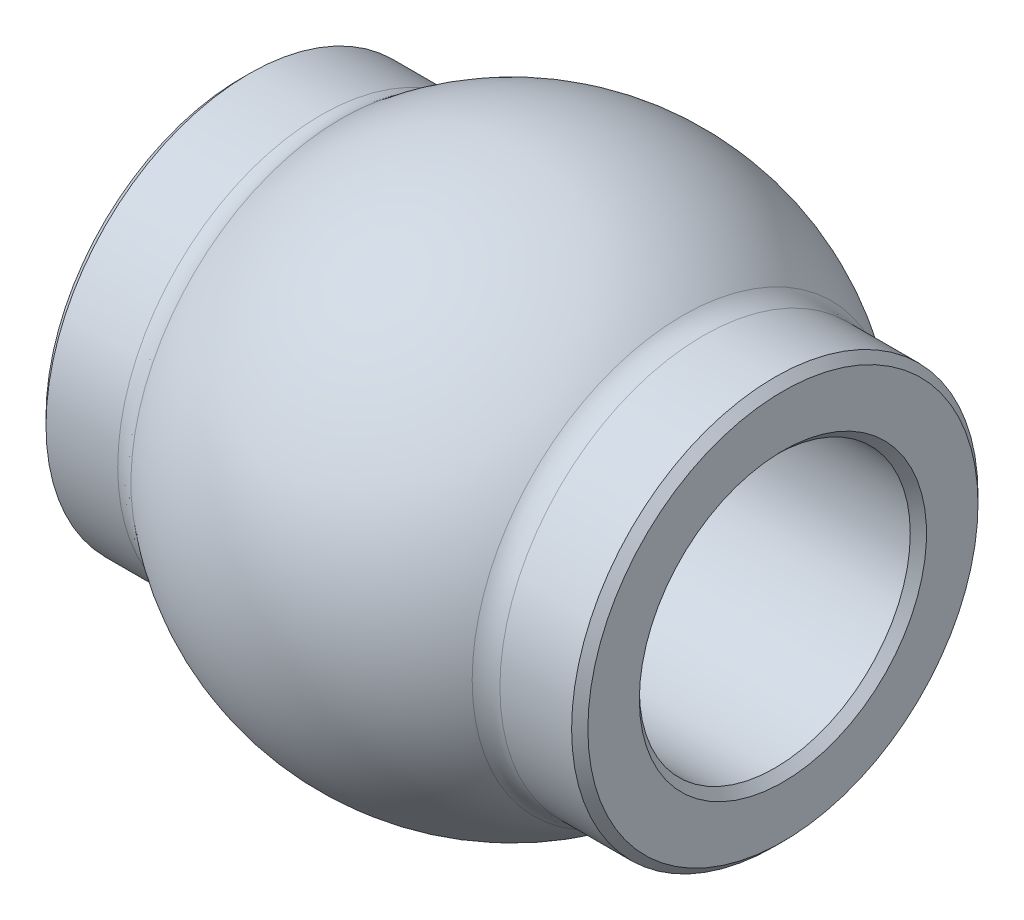
ISO-10303-21;
HEADER;
FILE_DESCRIPTION(('STEP AP214'),'2;1');
FILE_NAME('part.step','',(''),(''),'','','');
FILE_SCHEMA(('AUTOMOTIVE_DESIGN { 1 0 10303 214 1 1 1 1 }'));
ENDSEC;
DATA;
#1=APPLICATION_CONTEXT('core data for automotive mechanical design processes');
#2=APPLICATION_PROTOCOL_DEFINITION('international standard','automotive_design',2000,#1);
#3=PRODUCT_CONTEXT('',#1,'mechanical');
#4=PRODUCT('Part','Part','',(#3));
#5=PRODUCT_RELATED_PRODUCT_CATEGORY('part','',(#4));
#6=PRODUCT_DEFINITION_FORMATION('','',#4);
#7=PRODUCT_DEFINITION_CONTEXT('part definition',#1,'design');
#8=PRODUCT_DEFINITION('design','',#6,#7);
#9=PRODUCT_DEFINITION_SHAPE('','',#8);
#10=(LENGTH_UNIT() NAMED_UNIT(*) SI_UNIT(.MILLI.,.METRE.));
#11=(NAMED_UNIT(*) PLANE_ANGLE_UNIT() SI_UNIT($,.RADIAN.));
#12=(NAMED_UNIT(*) SI_UNIT($,.STERADIAN.) SOLID_ANGLE_UNIT());
#13=UNCERTAINTY_MEASURE_WITH_UNIT(LENGTH_MEASURE(1.E-05),#10,'distance_accuracy_value','');
#14=(GEOMETRIC_REPRESENTATION_CONTEXT(3) GLOBAL_UNCERTAINTY_ASSIGNED_CONTEXT((#13)) GLOBAL_UNIT_ASSIGNED_CONTEXT((#10,
#11,#12)) REPRESENTATION_CONTEXT('',''));
#15=CARTESIAN_POINT('',(0.,0.,0.));
#16=DIRECTION('',(0.,0.,1.));
#17=DIRECTION('',(1.,0.,0.));
#18=AXIS2_PLACEMENT_3D('',#15,#16,#17);
#19=CARTESIAN_POINT('',(-19.7341731109294,0.,0.));
#20=DIRECTION('',(-1.,0.,0.));
#21=DIRECTION('',(0.,0.,1.));
#22=AXIS2_PLACEMENT_3D('',#19,#20,#21);
#23=CYLINDRICAL_SURFACE('',#22,9.525);
#24=CARTESIAN_POINT('',(12.319,0.,0.));
#25=DIRECTION('',(-1.,0.,0.));
#26=DIRECTION('',(0.,0.,1.));
#27=AXIS2_PLACEMENT_3D('',#24,#25,#26);
#28=CIRCLE('',#27,9.525);
#29=CARTESIAN_POINT('',(12.319,0.,9.525));
#30=VERTEX_POINT('',#29);
#31=EDGE_CURVE('E40',#30,#30,#28,.T.);
#32=ORIENTED_EDGE('',*,*,#31,.T.);
#33=EDGE_LOOP('',(#32));
#34=FACE_BOUND('',#33,.T.);
#35=CARTESIAN_POINT('',(8.95777734708785,0.,0.));
#36=DIRECTION('',(-1.,0.,0.));
#37=DIRECTION('',(0.,0.,1.));
#38=AXIS2_PLACEMENT_3D('',#35,#36,#37);
#39=CIRCLE('',#38,9.525);
#40=CARTESIAN_POINT('',(8.95777734708785,0.,9.525));
#41=VERTEX_POINT('',#40);
#42=EDGE_CURVE('E68',#41,#41,#39,.F.);
#43=ORIENTED_EDGE('',*,*,#42,.T.);
#44=EDGE_LOOP('',(#43));
#45=FACE_BOUND('',#44,.T.);
#46=ADVANCED_FACE('F33',(#34,#45),#23,.T.);
#47=CARTESIAN_POINT('',(12.7,0.,0.));
#48=DIRECTION('',(-1.,0.,0.));
#49=DIRECTION('',(0.,0.,1.));
#50=AXIS2_PLACEMENT_3D('',#47,#48,#49);
#51=PLANE('',#50);
#52=CARTESIAN_POINT('',(12.7,0.,0.));
#53=DIRECTION('',(-1.,0.,0.));
#54=DIRECTION('',(0.,0.,1.));
#55=AXIS2_PLACEMENT_3D('',#52,#53,#54);
#56=CIRCLE('',#55,6.73099999999999);
#57=CARTESIAN_POINT('',(12.7,0.,6.73099999999999));
#58=VERTEX_POINT('',#57);
#59=EDGE_CURVE('E53',#58,#58,#56,.T.);
#60=ORIENTED_EDGE('',*,*,#59,.T.);
#61=EDGE_LOOP('',(#60));
#62=FACE_BOUND('',#61,.T.);
#63=CARTESIAN_POINT('',(12.7,0.,0.));
#64=DIRECTION('',(-1.,0.,0.));
#65=DIRECTION('',(0.,0.,1.));
#66=AXIS2_PLACEMENT_3D('',#63,#64,#65);
#67=CIRCLE('',#66,9.14400000000001);
#68=CARTESIAN_POINT('',(12.7,0.,9.14400000000001));
#69=VERTEX_POINT('',#68);
#70=EDGE_CURVE('E56',#69,#69,#67,.F.);
#71=ORIENTED_EDGE('',*,*,#70,.T.);
#72=EDGE_LOOP('',(#71));
#73=FACE_BOUND('',#72,.T.);
#74=ADVANCED_FACE('F99',(#62,#73),#51,.F.);
#75=CARTESIAN_POINT('',(-12.7,0.,0.));
#76=DIRECTION('',(1.,0.,0.));
#77=DIRECTION('',(0.,0.,-1.));
#78=AXIS2_PLACEMENT_3D('',#75,#76,#77);
#79=PLANE('',#78);
#80=CARTESIAN_POINT('',(-12.7,0.,0.));
#81=DIRECTION('',(1.,0.,0.));
#82=DIRECTION('',(0.,0.,-1.));
#83=AXIS2_PLACEMENT_3D('',#80,#81,#82);
#84=CIRCLE('',#83,6.731);
#85=CARTESIAN_POINT('',(-12.7,0.,-6.731));
#86=VERTEX_POINT('',#85);
#87=EDGE_CURVE('E44',#86,#86,#84,.T.);
#88=ORIENTED_EDGE('',*,*,#87,.T.);
#89=EDGE_LOOP('',(#88));
#90=FACE_BOUND('',#89,.T.);
#91=CARTESIAN_POINT('',(-12.7,0.,0.));
#92=DIRECTION('',(1.,0.,0.));
#93=DIRECTION('',(0.,0.,-1.));
#94=AXIS2_PLACEMENT_3D('',#91,#92,#93);
#95=CIRCLE('',#94,9.144);
#96=CARTESIAN_POINT('',(-12.7,0.,-9.144));
#97=VERTEX_POINT('',#96);
#98=EDGE_CURVE('E48',#97,#97,#95,.F.);
#99=ORIENTED_EDGE('',*,*,#98,.T.);
#100=EDGE_LOOP('',(#99));
#101=FACE_BOUND('',#100,.T.);
#102=ADVANCED_FACE('F90',(#90,#101),#79,.F.);
#103=CARTESIAN_POINT('',(-19.7341731109294,0.,0.));
#104=DIRECTION('',(-1.,0.,0.));
#105=DIRECTION('',(0.,0.,1.));
#106=AXIS2_PLACEMENT_3D('',#103,#104,#105);
#107=CYLINDRICAL_SURFACE('',#106,9.525);
#108=CARTESIAN_POINT('',(-12.319,0.,0.));
#109=DIRECTION('',(1.,0.,0.));
#110=DIRECTION('',(0.,0.,-1.));
#111=AXIS2_PLACEMENT_3D('',#108,#109,#110);
#112=CIRCLE('',#111,9.525);
#113=CARTESIAN_POINT('',(-12.319,0.,-9.525));
#114=VERTEX_POINT('',#113);
#115=EDGE_CURVE('E10',#114,#114,#112,.T.);
#116=ORIENTED_EDGE('',*,*,#115,.T.);
#117=EDGE_LOOP('',(#116));
#118=FACE_BOUND('',#117,.T.);
#119=CARTESIAN_POINT('',(-8.95777734708785,0.,0.));
#120=DIRECTION('',(1.,0.,0.));
#121=DIRECTION('',(0.,0.,-1.));
#122=AXIS2_PLACEMENT_3D('',#119,#120,#121);
#123=CIRCLE('',#122,9.525);
#124=CARTESIAN_POINT('',(-8.95777734708785,0.,-9.525));
#125=VERTEX_POINT('',#124);
#126=EDGE_CURVE('E65',#125,#125,#123,.F.);
#127=ORIENTED_EDGE('',*,*,#126,.T.);
#128=EDGE_LOOP('',(#127));
#129=FACE_BOUND('',#128,.T.);
#130=ADVANCED_FACE('F88',(#118,#129),#107,.T.);
#131=CARTESIAN_POINT('',(0.,0.,0.));
#132=DIRECTION('',(-1.,0.,0.));
#133=DIRECTION('',(0.,1.,0.));
#134=AXIS2_PLACEMENT_3D('',#131,#132,#133);
#135=SPHERICAL_SURFACE('',#134,12.7);
#136=CARTESIAN_POINT('',(7.9980154884713,0.,0.));
#137=DIRECTION('',(-1.,0.,0.));
#138=DIRECTION('',(0.,0.,1.));
#139=AXIS2_PLACEMENT_3D('',#136,#137,#138);
#140=CIRCLE('',#139,9.86517857142857);
#141=CARTESIAN_POINT('',(7.9980154884713,9.86517857142856,0.));
#142=VERTEX_POINT('',#141);
#143=EDGE_CURVE('E71',#142,#142,#140,.T.);
#144=CARTESIAN_POINT('',(-7.9980154884713,0.,0.));
#145=DIRECTION('',(1.,0.,0.));
#146=DIRECTION('',(0.,0.,-1.));
#147=AXIS2_PLACEMENT_3D('',#144,#145,#146);
#148=CIRCLE('',#147,9.86517857142857);
#149=CARTESIAN_POINT('',(-7.9980154884713,9.86517857142856,0.));
#150=VERTEX_POINT('',#149);
#151=EDGE_CURVE('E74',#150,#150,#148,.T.);
#152=CARTESIAN_POINT('',(7.9980154884713,9.86517857142856,0.));
#153=CARTESIAN_POINT('',(7.85800324572026,9.97869418364085,0.));
#154=CARTESIAN_POINT('',(7.71557145775517,10.0892251073674,0.));
#155=CARTESIAN_POINT('',(7.42613350640541,10.3041260340785,0.));
#156=CARTESIAN_POINT('',(7.27912734302074,10.408496037063,0.));
#157=CARTESIAN_POINT('',(6.98080535584032,10.6108835785192,0.));
#158=CARTESIAN_POINT('',(6.82948953204458,10.7089011169909,0.));
#159=CARTESIAN_POINT('',(6.52282297259072,10.8984066926035,0.));
#160=CARTESIAN_POINT('',(6.36747223693261,10.9898947297443,0.));
#161=CARTESIAN_POINT('',(6.05301732077754,11.1661752996362,0.));
#162=CARTESIAN_POINT('',(5.89391314028059,11.2509678323872,0.));
#163=CARTESIAN_POINT('',(5.5722397645777,11.4137037417259,0.));
#164=CARTESIAN_POINT('',(5.40967056937176,11.4916471183135,0.));
#165=CARTESIAN_POINT('',(5.08136183241597,11.6405434209467,0.));
#166=CARTESIAN_POINT('',(4.91562229066613,11.7114963469922,0.));
#167=CARTESIAN_POINT('',(4.58127328689367,11.8462831406616,0.));
#168=CARTESIAN_POINT('',(4.41266382487105,11.9101170082855,0.));
#169=CARTESIAN_POINT('',(4.07288060584844,12.0305499772913,0.));
#170=CARTESIAN_POINT('',(3.90170684884845,12.0871490786733,0.));
#171=CARTESIAN_POINT('',(3.5571053140972,12.1930099224102,0.));
#172=CARTESIAN_POINT('',(3.38367753634595,12.2422716647651,0.));
#173=CARTESIAN_POINT('',(3.03488231979527,12.3333684972558,0.));
#174=CARTESIAN_POINT('',(2.85951488099585,12.3752035873915,0.));
#175=CARTESIAN_POINT('',(2.50715821799157,12.4513712840764,0.));
#176=CARTESIAN_POINT('',(2.33016899378671,12.4857038906256,0.));
#177=CARTESIAN_POINT('',(1.97488957528933,12.5468043879474,0.));
#178=CARTESIAN_POINT('',(1.79659938099682,12.5735722787201,0.));
#179=CARTESIAN_POINT('',(1.43904119581872,12.6194948243077,0.));
#180=CARTESIAN_POINT('',(1.25977320493314,12.6386494791226,0.));
#181=CARTESIAN_POINT('',(0.900584372442216,12.6693108325634,0.));
#182=CARTESIAN_POINT('',(0.720663530836862,12.6808175311893,0.));
#183=CARTESIAN_POINT('',(0.36049512615434,12.6961621149076,0.));
#184=CARTESIAN_POINT('',(0.180247563077172,12.7,0.));
#185=CARTESIAN_POINT('',(-0.180247563077166,12.7,0.));
#186=CARTESIAN_POINT('',(-0.360495126154335,12.6961621149076,0.));
#187=CARTESIAN_POINT('',(-0.720663530836856,12.6808175311893,0.));
#188=CARTESIAN_POINT('',(-0.90058437244221,12.6693108325634,0.));
#189=CARTESIAN_POINT('',(-1.25977320493314,12.6386494791226,0.));
#190=CARTESIAN_POINT('',(-1.43904119581871,12.6194948243077,0.));
#191=CARTESIAN_POINT('',(-1.79659938099681,12.5735722787201,0.));
#192=CARTESIAN_POINT('',(-1.97488957528933,12.5468043879474,0.));
#193=CARTESIAN_POINT('',(-2.33016899378671,12.4857038906256,0.));
#194=CARTESIAN_POINT('',(-2.50715821799157,12.4513712840764,0.));
#195=CARTESIAN_POINT('',(-2.85951488099585,12.3752035873915,0.));
#196=CARTESIAN_POINT('',(-3.03488231979527,12.3333684972558,0.));
#197=CARTESIAN_POINT('',(-3.38367753634594,12.2422716647651,0.));
#198=CARTESIAN_POINT('',(-3.55710531409719,12.1930099224102,0.));
#199=CARTESIAN_POINT('',(-3.90170684884844,12.0871490786733,0.));
#200=CARTESIAN_POINT('',(-4.07288060584844,12.0305499772913,0.));
#201=CARTESIAN_POINT('',(-4.41266382487105,11.9101170082855,0.));
#202=CARTESIAN_POINT('',(-4.58127328689366,11.8462831406616,0.));
#203=CARTESIAN_POINT('',(-4.91562229066612,11.7114963469922,0.));
#204=CARTESIAN_POINT('',(-5.08136183241597,11.6405434209467,0.));
#205=CARTESIAN_POINT('',(-5.40967056937176,11.4916471183135,0.));
#206=CARTESIAN_POINT('',(-5.5722397645777,11.4137037417259,0.));
#207=CARTESIAN_POINT('',(-5.89391314028059,11.2509678323872,0.));
#208=CARTESIAN_POINT('',(-6.05301732077754,11.1661752996362,0.));
#209=CARTESIAN_POINT('',(-6.3674722369326,10.9898947297443,0.));
#210=CARTESIAN_POINT('',(-6.52282297259072,10.8984066926035,0.));
#211=CARTESIAN_POINT('',(-6.82948953204458,10.7089011169909,0.));
#212=CARTESIAN_POINT('',(-6.98080535584032,10.6108835785192,0.));
#213=CARTESIAN_POINT('',(-7.27912734302073,10.408496037063,0.));
#214=CARTESIAN_POINT('',(-7.4261335064054,10.3041260340785,0.));
#215=CARTESIAN_POINT('',(-7.71557145775517,10.0892251073674,0.));
#216=CARTESIAN_POINT('',(-7.85800324572026,9.97869418364085,0.));
#217=CARTESIAN_POINT('',(-7.9980154884713,9.86517857142856,0.));
#218=B_SPLINE_CURVE_WITH_KNOTS('',3,(#152,#153,#154,#155,#156,#157,#158,#159,#160,#161,#162,
#163,#164,#165,#166,#167,#168,#169,#170,#171,#172,#173,#174,#175,#176,#177,#178,#179,#180,#181,
#182,#183,#184,#185,#186,#187,#188,#189,#190,#191,#192,#193,#194,#195,#196,#197,#198,#199,#200,
#201,#202,#203,#204,#205,#206,#207,#208,#209,#210,#211,#212,#213,#214,#215,#216,#217),
.UNSPECIFIED.,.F.,.F.,(4,2,2,2,2,2,2,2,2,2,2,2,2,2,2,2,2,2,2,2,2,2,2,2,2,2,2,2,2,2,2,2,4),(0.,
0.540701853677429,1.08140370735486,1.62210556103229,2.16280741470972,2.70350926838715,
3.24421112206458,3.78491297574201,4.32561482941944,4.86631668309687,5.4070185367743,
5.94772039045173,6.48842224412916,7.02912409780659,7.56982595148402,8.11052780516145,
8.65122965883888,9.19193151251631,9.73263336619375,10.2733352198712,10.8140370735486,
11.354738927226,11.8954407809035,12.4361426345809,12.9768444882583,13.5175463419358,
14.0582481956132,14.5989500492906,15.139651902968,15.6803537566455,16.2210556103229,
16.7617574640003,17.3024593176778),.UNSPECIFIED.);
#219=EDGE_CURVE('BSEAM78',#142,#150,#218,.T.);
#220=ORIENTED_EDGE('',*,*,#143,.T.);
#221=ORIENTED_EDGE('',*,*,#151,.T.);
#222=ORIENTED_EDGE('',*,*,#219,.T.);
#223=ORIENTED_EDGE('',*,*,#219,.F.);
#224=EDGE_LOOP('',(#220,#222,#221,#223));
#225=FACE_BOUND('',#224,.T.);
#226=ADVANCED_FACE('F78',(#225),#135,.T.);
#227=CARTESIAN_POINT('',(-12.7,0.,0.));
#228=DIRECTION('',(1.,0.,0.));
#229=DIRECTION('',(0.,0.,-1.));
#230=AXIS2_PLACEMENT_3D('',#227,#228,#229);
#231=CYLINDRICAL_SURFACE('',#230,6.35);
#232=CARTESIAN_POINT('',(12.319,0.,0.));
#233=DIRECTION('',(-1.,0.,0.));
#234=DIRECTION('',(0.,0.,1.));
#235=AXIS2_PLACEMENT_3D('',#232,#233,#234);
#236=CIRCLE('',#235,6.35);
#237=CARTESIAN_POINT('',(12.319,0.,6.35));
#238=VERTEX_POINT('',#237);
#239=EDGE_CURVE('E59',#238,#238,#236,.F.);
#240=ORIENTED_EDGE('',*,*,#239,.T.);
#241=EDGE_LOOP('',(#240));
#242=FACE_BOUND('',#241,.T.);
#243=CARTESIAN_POINT('',(-12.319,0.,0.));
#244=DIRECTION('',(1.,0.,0.));
#245=DIRECTION('',(0.,0.,-1.));
#246=AXIS2_PLACEMENT_3D('',#243,#244,#245);
#247=CIRCLE('',#246,6.35);
#248=CARTESIAN_POINT('',(-12.319,0.,-6.35));
#249=VERTEX_POINT('',#248);
#250=EDGE_CURVE('E62',#249,#249,#247,.F.);
#251=ORIENTED_EDGE('',*,*,#250,.T.);
#252=EDGE_LOOP('',(#251));
#253=FACE_BOUND('',#252,.T.);
#254=ADVANCED_FACE('F96',(#242,#253),#231,.F.);
#255=CARTESIAN_POINT('',(8.95777734708785,0.,0.));
#256=DIRECTION('',(-1.,0.,0.));
#257=DIRECTION('',(0.,0.,1.));
#258=AXIS2_PLACEMENT_3D('',#255,#256,#257);
#259=TOROIDAL_SURFACE('',#258,11.049,1.524);
#260=ORIENTED_EDGE('',*,*,#42,.F.);
#261=EDGE_LOOP('',(#260));
#262=FACE_BOUND('',#261,.T.);
#263=ORIENTED_EDGE('',*,*,#143,.F.);
#264=EDGE_LOOP('',(#263));
#265=FACE_BOUND('',#264,.T.);
#266=ADVANCED_FACE('F84',(#262,#265),#259,.F.);
#267=CARTESIAN_POINT('',(-8.95777734708785,0.,0.));
#268=DIRECTION('',(1.,0.,0.));
#269=DIRECTION('',(0.,0.,-1.));
#270=AXIS2_PLACEMENT_3D('',#267,#268,#269);
#271=TOROIDAL_SURFACE('',#270,11.049,1.524);
#272=ORIENTED_EDGE('',*,*,#151,.F.);
#273=EDGE_LOOP('',(#272));
#274=FACE_BOUND('',#273,.T.);
#275=ORIENTED_EDGE('',*,*,#126,.F.);
#276=EDGE_LOOP('',(#275));
#277=FACE_BOUND('',#276,.T.);
#278=ADVANCED_FACE('F80',(#274,#277),#271,.F.);
#279=CARTESIAN_POINT('',(12.319,0.,0.));
#280=DIRECTION('',(1.,0.,0.));
#281=DIRECTION('',(0.,0.,-1.));
#282=AXIS2_PLACEMENT_3D('',#279,#280,#281);
#283=CONICAL_SURFACE('',#282,6.35,0.785398163397451);
#284=ORIENTED_EDGE('',*,*,#59,.F.);
#285=EDGE_LOOP('',(#284));
#286=FACE_BOUND('',#285,.T.);
#287=ORIENTED_EDGE('',*,*,#239,.F.);
#288=EDGE_LOOP('',(#287));
#289=FACE_BOUND('',#288,.T.);
#290=ADVANCED_FACE('F83',(#286,#289),#283,.F.);
#291=CARTESIAN_POINT('',(-12.7,0.,0.));
#292=DIRECTION('',(-1.,0.,0.));
#293=DIRECTION('',(0.,0.,1.));
#294=AXIS2_PLACEMENT_3D('',#291,#292,#293);
#295=CONICAL_SURFACE('',#294,6.731,0.785398163397442);
#296=ORIENTED_EDGE('',*,*,#250,.F.);
#297=EDGE_LOOP('',(#296));
#298=FACE_BOUND('',#297,.T.);
#299=ORIENTED_EDGE('',*,*,#87,.F.);
#300=EDGE_LOOP('',(#299));
#301=FACE_BOUND('',#300,.T.);
#302=ADVANCED_FACE('F116',(#298,#301),#295,.F.);
#303=CARTESIAN_POINT('',(12.319,0.,0.));
#304=DIRECTION('',(-1.,0.,0.));
#305=DIRECTION('',(0.,0.,1.));
#306=AXIS2_PLACEMENT_3D('',#303,#304,#305);
#307=CONICAL_SURFACE('',#306,9.525,0.785398163397453);
#308=ORIENTED_EDGE('',*,*,#70,.F.);
#309=EDGE_LOOP('',(#308));
#310=FACE_BOUND('',#309,.T.);
#311=ORIENTED_EDGE('',*,*,#31,.F.);
#312=EDGE_LOOP('',(#311));
#313=FACE_BOUND('',#312,.T.);
#314=ADVANCED_FACE('F119',(#310,#313),#307,.T.);
#315=CARTESIAN_POINT('',(-12.7,0.,0.));
#316=DIRECTION('',(1.,0.,0.));
#317=DIRECTION('',(0.,0.,-1.));
#318=AXIS2_PLACEMENT_3D('',#315,#316,#317);
#319=CONICAL_SURFACE('',#318,9.144,0.785398163397448);
#320=ORIENTED_EDGE('',*,*,#115,.F.);
#321=EDGE_LOOP('',(#320));
#322=FACE_BOUND('',#321,.T.);
#323=ORIENTED_EDGE('',*,*,#98,.F.);
#324=EDGE_LOOP('',(#323));
#325=FACE_BOUND('',#324,.T.);
#326=ADVANCED_FACE('F35',(#322,#325),#319,.T.);
#327=CLOSED_SHELL('',(#46,#74,#102,#130,#226,#254,#266,#278,#290,#302,#314,#326));
#328=MANIFOLD_SOLID_BREP('B2',#327);
#329=ADVANCED_BREP_SHAPE_REPRESENTATION('',(#18,#328),#14);
#330=SHAPE_DEFINITION_REPRESENTATION(#9,#329);
ENDSEC;
END-ISO-10303-21;
